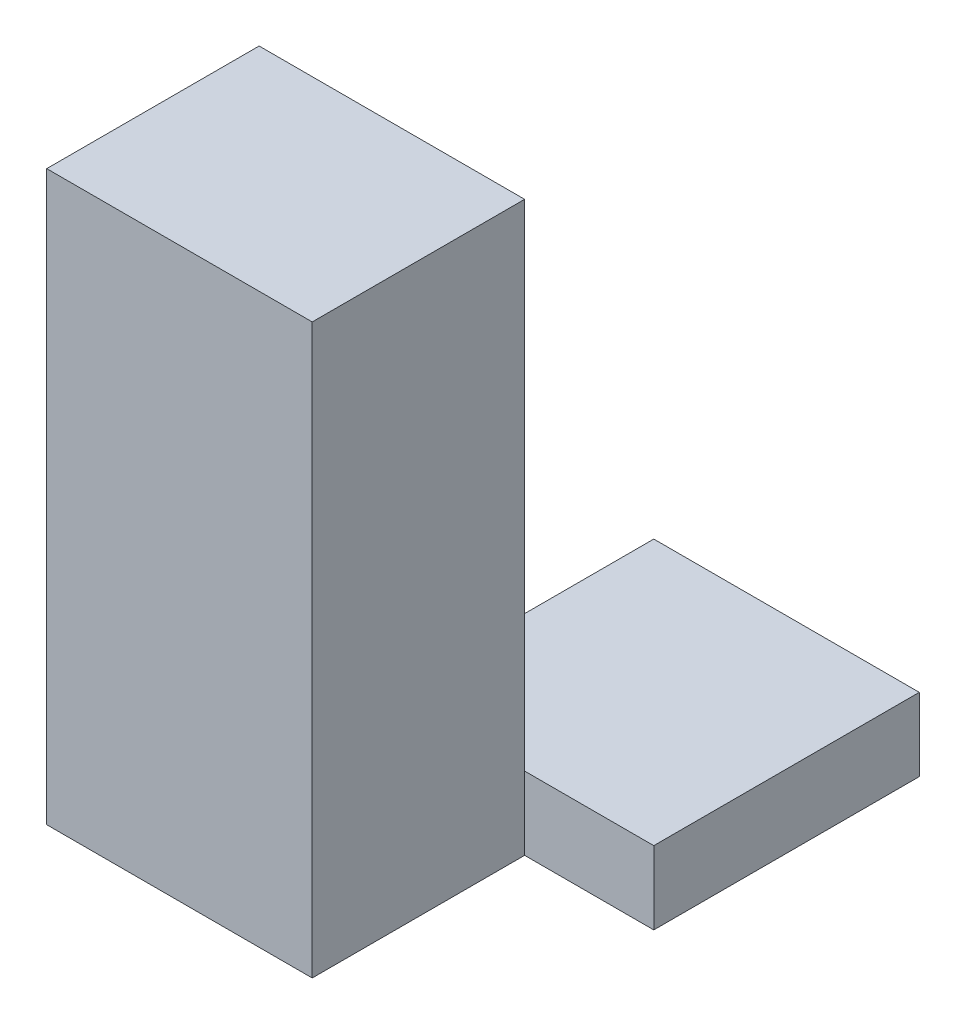
ISO-10303-21;
HEADER;
FILE_DESCRIPTION(('STEP AP214'),'2;1');
FILE_NAME('part.step','',(''),(''),'','','');
FILE_SCHEMA(('AUTOMOTIVE_DESIGN { 1 0 10303 214 1 1 1 1 }'));
ENDSEC;
DATA;
#1=APPLICATION_CONTEXT('core data for automotive mechanical design processes');
#2=APPLICATION_PROTOCOL_DEFINITION('international standard','automotive_design',2000,#1);
#3=PRODUCT_CONTEXT('',#1,'mechanical');
#4=PRODUCT('Part','Part','',(#3));
#5=PRODUCT_RELATED_PRODUCT_CATEGORY('part','',(#4));
#6=PRODUCT_DEFINITION_FORMATION('','',#4);
#7=PRODUCT_DEFINITION_CONTEXT('part definition',#1,'design');
#8=PRODUCT_DEFINITION('design','',#6,#7);
#9=PRODUCT_DEFINITION_SHAPE('','',#8);
#10=(LENGTH_UNIT() NAMED_UNIT(*) SI_UNIT(.MILLI.,.METRE.));
#11=(NAMED_UNIT(*) PLANE_ANGLE_UNIT() SI_UNIT($,.RADIAN.));
#12=(NAMED_UNIT(*) SI_UNIT($,.STERADIAN.) SOLID_ANGLE_UNIT());
#13=UNCERTAINTY_MEASURE_WITH_UNIT(LENGTH_MEASURE(1.E-05),#10,'distance_accuracy_value','');
#14=(GEOMETRIC_REPRESENTATION_CONTEXT(3) GLOBAL_UNCERTAINTY_ASSIGNED_CONTEXT((#13)) GLOBAL_UNIT_ASSIGNED_CONTEXT((#10,
#11,#12)) REPRESENTATION_CONTEXT('',''));
#15=CARTESIAN_POINT('',(0.,0.,0.));
#16=DIRECTION('',(0.,0.,1.));
#17=DIRECTION('',(1.,0.,0.));
#18=AXIS2_PLACEMENT_3D('',#15,#16,#17);
#19=CARTESIAN_POINT('',(0.,0.,0.));
#20=DIRECTION('',(0.,0.,-1.));
#21=DIRECTION('',(-1.,0.,0.));
#22=AXIS2_PLACEMENT_3D('',#19,#20,#21);
#23=PLANE('',#22);
#24=DIRECTION('',(-1.,0.,0.));
#25=VECTOR('',#24,1.);
#26=CARTESIAN_POINT('',(40.,-46.7266968325792,0.));
#27=LINE('',#26,#25);
#28=CARTESIAN_POINT('',(20.5429864253394,-46.7266968325792,0.));
#29=VERTEX_POINT('',#28);
#30=CARTESIAN_POINT('',(0.,-46.7266968325792,0.));
#31=VERTEX_POINT('',#30);
#32=EDGE_CURVE('E11',#29,#31,#27,.T.);
#33=ORIENTED_EDGE('',*,*,#32,.T.);
#34=DIRECTION('',(0.,-1.,0.));
#35=VECTOR('',#34,1.);
#36=CARTESIAN_POINT('',(0.,-57.7266968325792,0.));
#37=LINE('',#36,#35);
#38=CARTESIAN_POINT('',(0.,-57.7266968325792,0.));
#39=VERTEX_POINT('',#38);
#40=EDGE_CURVE('E61',#31,#39,#37,.T.);
#41=ORIENTED_EDGE('',*,*,#40,.T.);
#42=DIRECTION('',(1.,0.,0.));
#43=VECTOR('',#42,1.);
#44=CARTESIAN_POINT('',(-19.4570135746606,-57.7266968325792,0.));
#45=LINE('',#44,#43);
#46=CARTESIAN_POINT('',(-19.4570135746606,-57.7266968325792,0.));
#47=VERTEX_POINT('',#46);
#48=EDGE_CURVE('E170',#47,#39,#45,.T.);
#49=ORIENTED_EDGE('',*,*,#48,.F.);
#50=DIRECTION('',(0.,-1.,0.));
#51=VECTOR('',#50,1.);
#52=CARTESIAN_POINT('',(-19.4570135746606,-57.7266968325792,0.));
#53=LINE('',#52,#51);
#54=CARTESIAN_POINT('',(-19.4570135746606,27.8733031674208,0.));
#55=VERTEX_POINT('',#54);
#56=EDGE_CURVE('E91',#55,#47,#53,.T.);
#57=ORIENTED_EDGE('',*,*,#56,.F.);
#58=DIRECTION('',(-1.,0.,0.));
#59=VECTOR('',#58,1.);
#60=CARTESIAN_POINT('',(-19.4570135746606,27.8733031674208,0.));
#61=LINE('',#60,#59);
#62=CARTESIAN_POINT('',(20.5429864253394,27.8733031674208,0.));
#63=VERTEX_POINT('',#62);
#64=EDGE_CURVE('E177',#63,#55,#61,.T.);
#65=ORIENTED_EDGE('',*,*,#64,.F.);
#66=DIRECTION('',(0.,1.,0.));
#67=VECTOR('',#66,1.);
#68=CARTESIAN_POINT('',(20.5429864253394,-57.7266968325792,0.));
#69=LINE('',#68,#67);
#70=EDGE_CURVE('E160',#29,#63,#69,.T.);
#71=ORIENTED_EDGE('',*,*,#70,.F.);
#72=EDGE_LOOP('',(#33,#41,#49,#57,#65,#71));
#73=FACE_BOUND('',#72,.T.);
#74=ADVANCED_FACE('F44',(#73),#23,.T.);
#75=CARTESIAN_POINT('',(20.5429864253394,-57.7266968325792,32.));
#76=DIRECTION('',(-1.,0.,0.));
#77=DIRECTION('',(0.,0.,1.));
#78=AXIS2_PLACEMENT_3D('',#75,#76,#77);
#79=PLANE('',#78);
#80=CARTESIAN_POINT('',(20.5429864253394,-57.7266968325792,0.));
#81=VERTEX_POINT('',#80);
#82=EDGE_CURVE('E154',#81,#29,#69,.T.);
#83=ORIENTED_EDGE('',*,*,#82,.T.);
#84=ORIENTED_EDGE('',*,*,#70,.T.);
#85=DIRECTION('',(0.,0.,-1.));
#86=VECTOR('',#85,1.);
#87=CARTESIAN_POINT('',(20.5429864253394,27.8733031674208,32.));
#88=LINE('',#87,#86);
#89=CARTESIAN_POINT('',(20.5429864253394,27.8733031674208,32.));
#90=VERTEX_POINT('',#89);
#91=EDGE_CURVE('E47',#90,#63,#88,.T.);
#92=ORIENTED_EDGE('',*,*,#91,.F.);
#93=DIRECTION('',(0.,1.,0.));
#94=VECTOR('',#93,1.);
#95=CARTESIAN_POINT('',(20.5429864253394,-57.7266968325792,32.));
#96=LINE('',#95,#94);
#97=CARTESIAN_POINT('',(20.5429864253394,-57.7266968325792,32.));
#98=VERTEX_POINT('',#97);
#99=EDGE_CURVE('E168',#98,#90,#96,.T.);
#100=ORIENTED_EDGE('',*,*,#99,.F.);
#101=DIRECTION('',(0.,0.,-1.));
#102=VECTOR('',#101,1.);
#103=CARTESIAN_POINT('',(20.5429864253394,-57.7266968325792,32.));
#104=LINE('',#103,#102);
#105=EDGE_CURVE('E176',#98,#81,#104,.T.);
#106=ORIENTED_EDGE('',*,*,#105,.T.);
#107=EDGE_LOOP('',(#83,#84,#92,#100,#106));
#108=FACE_BOUND('',#107,.T.);
#109=ADVANCED_FACE('F50',(#108),#79,.F.);
#110=CARTESIAN_POINT('',(-19.4570135746606,27.8733031674208,32.));
#111=DIRECTION('',(0.,-1.,0.));
#112=DIRECTION('',(0.,0.,-1.));
#113=AXIS2_PLACEMENT_3D('',#110,#111,#112);
#114=PLANE('',#113);
#115=ORIENTED_EDGE('',*,*,#64,.T.);
#116=DIRECTION('',(0.,0.,-1.));
#117=VECTOR('',#116,1.);
#118=CARTESIAN_POINT('',(-19.4570135746606,27.8733031674208,32.));
#119=LINE('',#118,#117);
#120=CARTESIAN_POINT('',(-19.4570135746606,27.8733031674208,32.));
#121=VERTEX_POINT('',#120);
#122=EDGE_CURVE('E189',#121,#55,#119,.T.);
#123=ORIENTED_EDGE('',*,*,#122,.F.);
#124=DIRECTION('',(-1.,0.,0.));
#125=VECTOR('',#124,1.);
#126=CARTESIAN_POINT('',(-19.4570135746606,27.8733031674208,32.));
#127=LINE('',#126,#125);
#128=EDGE_CURVE('E98',#90,#121,#127,.T.);
#129=ORIENTED_EDGE('',*,*,#128,.F.);
#130=ORIENTED_EDGE('',*,*,#91,.T.);
#131=EDGE_LOOP('',(#115,#123,#129,#130));
#132=FACE_BOUND('',#131,.T.);
#133=ADVANCED_FACE('F193',(#132),#114,.F.);
#134=CARTESIAN_POINT('',(-19.4570135746606,-57.7266968325792,32.));
#135=DIRECTION('',(1.,0.,0.));
#136=DIRECTION('',(0.,1.,0.));
#137=AXIS2_PLACEMENT_3D('',#134,#135,#136);
#138=PLANE('',#137);
#139=ORIENTED_EDGE('',*,*,#56,.T.);
#140=DIRECTION('',(0.,0.,-1.));
#141=VECTOR('',#140,1.);
#142=CARTESIAN_POINT('',(-19.4570135746606,-57.7266968325792,32.));
#143=LINE('',#142,#141);
#144=CARTESIAN_POINT('',(-19.4570135746606,-57.7266968325792,32.));
#145=VERTEX_POINT('',#144);
#146=EDGE_CURVE('E187',#145,#47,#143,.T.);
#147=ORIENTED_EDGE('',*,*,#146,.F.);
#148=DIRECTION('',(0.,-1.,0.));
#149=VECTOR('',#148,1.);
#150=CARTESIAN_POINT('',(-19.4570135746606,-57.7266968325792,32.));
#151=LINE('',#150,#149);
#152=EDGE_CURVE('E175',#121,#145,#151,.T.);
#153=ORIENTED_EDGE('',*,*,#152,.F.);
#154=ORIENTED_EDGE('',*,*,#122,.T.);
#155=EDGE_LOOP('',(#139,#147,#153,#154));
#156=FACE_BOUND('',#155,.T.);
#157=ADVANCED_FACE('F201',(#156),#138,.F.);
#158=CARTESIAN_POINT('',(-19.4570135746606,-57.7266968325792,32.));
#159=DIRECTION('',(0.,1.,0.));
#160=DIRECTION('',(0.,0.,1.));
#161=AXIS2_PLACEMENT_3D('',#158,#159,#160);
#162=PLANE('',#161);
#163=ORIENTED_EDGE('',*,*,#48,.T.);
#164=DIRECTION('',(0.,0.,-1.));
#165=VECTOR('',#164,1.);
#166=CARTESIAN_POINT('',(0.,-57.7266968325792,0.));
#167=LINE('',#166,#165);
#168=CARTESIAN_POINT('',(0.,-57.7266968325792,-40.));
#169=VERTEX_POINT('',#168);
#170=EDGE_CURVE('E205',#39,#169,#167,.T.);
#171=ORIENTED_EDGE('',*,*,#170,.T.);
#172=DIRECTION('',(-1.,0.,0.));
#173=VECTOR('',#172,1.);
#174=CARTESIAN_POINT('',(40.,-57.7266968325792,-40.));
#175=LINE('',#174,#173);
#176=CARTESIAN_POINT('',(40.,-57.7266968325792,-40.));
#177=VERTEX_POINT('',#176);
#178=EDGE_CURVE('E136',#177,#169,#175,.T.);
#179=ORIENTED_EDGE('',*,*,#178,.F.);
#180=DIRECTION('',(0.,0.,-1.));
#181=VECTOR('',#180,1.);
#182=CARTESIAN_POINT('',(40.,-57.7266968325792,0.));
#183=LINE('',#182,#181);
#184=CARTESIAN_POINT('',(40.,-57.7266968325792,0.));
#185=VERTEX_POINT('',#184);
#186=EDGE_CURVE('E126',#185,#177,#183,.T.);
#187=ORIENTED_EDGE('',*,*,#186,.F.);
#188=DIRECTION('',(-1.,0.,0.));
#189=VECTOR('',#188,1.);
#190=CARTESIAN_POINT('',(40.,-57.7266968325792,0.));
#191=LINE('',#190,#189);
#192=EDGE_CURVE('E133',#185,#81,#191,.T.);
#193=ORIENTED_EDGE('',*,*,#192,.T.);
#194=ORIENTED_EDGE('',*,*,#105,.F.);
#195=DIRECTION('',(1.,0.,0.));
#196=VECTOR('',#195,1.);
#197=CARTESIAN_POINT('',(-19.4570135746606,-57.7266968325792,32.));
#198=LINE('',#197,#196);
#199=EDGE_CURVE('E75',#145,#98,#198,.T.);
#200=ORIENTED_EDGE('',*,*,#199,.F.);
#201=ORIENTED_EDGE('',*,*,#146,.T.);
#202=EDGE_LOOP('',(#163,#171,#179,#187,#193,#194,#200,#201));
#203=FACE_BOUND('',#202,.T.);
#204=ADVANCED_FACE('F131',(#203),#162,.F.);
#205=CARTESIAN_POINT('',(0.,0.,32.));
#206=DIRECTION('',(0.,0.,-1.));
#207=DIRECTION('',(-1.,0.,0.));
#208=AXIS2_PLACEMENT_3D('',#205,#206,#207);
#209=PLANE('',#208);
#210=ORIENTED_EDGE('',*,*,#99,.T.);
#211=ORIENTED_EDGE('',*,*,#128,.T.);
#212=ORIENTED_EDGE('',*,*,#152,.T.);
#213=ORIENTED_EDGE('',*,*,#199,.T.);
#214=EDGE_LOOP('',(#210,#211,#212,#213));
#215=FACE_BOUND('',#214,.T.);
#216=ADVANCED_FACE('F204',(#215),#209,.F.);
#217=CARTESIAN_POINT('',(40.,-57.7266968325792,0.));
#218=DIRECTION('',(0.,0.,-1.));
#219=DIRECTION('',(-1.,0.,0.));
#220=AXIS2_PLACEMENT_3D('',#217,#218,#219);
#221=PLANE('',#220);
#222=ORIENTED_EDGE('',*,*,#82,.F.);
#223=ORIENTED_EDGE('',*,*,#192,.F.);
#224=DIRECTION('',(0.,-1.,0.));
#225=VECTOR('',#224,1.);
#226=CARTESIAN_POINT('',(40.,-57.7266968325792,0.));
#227=LINE('',#226,#225);
#228=CARTESIAN_POINT('',(40.,-46.7266968325792,0.));
#229=VERTEX_POINT('',#228);
#230=EDGE_CURVE('E141',#229,#185,#227,.T.);
#231=ORIENTED_EDGE('',*,*,#230,.F.);
#232=EDGE_CURVE('E57',#229,#29,#27,.T.);
#233=ORIENTED_EDGE('',*,*,#232,.T.);
#234=EDGE_LOOP('',(#222,#223,#231,#233));
#235=FACE_BOUND('',#234,.T.);
#236=ADVANCED_FACE('F151',(#235),#221,.F.);
#237=CARTESIAN_POINT('',(40.,-57.7266968325792,-40.));
#238=DIRECTION('',(0.,0.,1.));
#239=DIRECTION('',(1.,0.,0.));
#240=AXIS2_PLACEMENT_3D('',#237,#238,#239);
#241=PLANE('',#240);
#242=DIRECTION('',(0.,1.,0.));
#243=VECTOR('',#242,1.);
#244=CARTESIAN_POINT('',(0.,-57.7266968325792,-40.));
#245=LINE('',#244,#243);
#246=CARTESIAN_POINT('',(0.,-46.7266968325792,-40.));
#247=VERTEX_POINT('',#246);
#248=EDGE_CURVE('E301',#169,#247,#245,.T.);
#249=ORIENTED_EDGE('',*,*,#248,.T.);
#250=DIRECTION('',(-1.,0.,0.));
#251=VECTOR('',#250,1.);
#252=CARTESIAN_POINT('',(40.,-46.7266968325792,-40.));
#253=LINE('',#252,#251);
#254=CARTESIAN_POINT('',(40.,-46.7266968325792,-40.));
#255=VERTEX_POINT('',#254);
#256=EDGE_CURVE('E165',#255,#247,#253,.T.);
#257=ORIENTED_EDGE('',*,*,#256,.F.);
#258=DIRECTION('',(0.,1.,0.));
#259=VECTOR('',#258,1.);
#260=CARTESIAN_POINT('',(40.,-57.7266968325792,-40.));
#261=LINE('',#260,#259);
#262=EDGE_CURVE('E139',#177,#255,#261,.T.);
#263=ORIENTED_EDGE('',*,*,#262,.F.);
#264=ORIENTED_EDGE('',*,*,#178,.T.);
#265=EDGE_LOOP('',(#249,#257,#263,#264));
#266=FACE_BOUND('',#265,.T.);
#267=ADVANCED_FACE('F212',(#266),#241,.F.);
#268=CARTESIAN_POINT('',(40.,-46.7266968325792,0.));
#269=DIRECTION('',(0.,-1.,0.));
#270=DIRECTION('',(0.,0.,-1.));
#271=AXIS2_PLACEMENT_3D('',#268,#269,#270);
#272=PLANE('',#271);
#273=DIRECTION('',(0.,0.,1.));
#274=VECTOR('',#273,1.);
#275=CARTESIAN_POINT('',(0.,-46.7266968325792,0.));
#276=LINE('',#275,#274);
#277=EDGE_CURVE('E153',#247,#31,#276,.T.);
#278=ORIENTED_EDGE('',*,*,#277,.T.);
#279=ORIENTED_EDGE('',*,*,#32,.F.);
#280=ORIENTED_EDGE('',*,*,#232,.F.);
#281=DIRECTION('',(0.,0.,1.));
#282=VECTOR('',#281,1.);
#283=CARTESIAN_POINT('',(40.,-46.7266968325792,0.));
#284=LINE('',#283,#282);
#285=EDGE_CURVE('E147',#255,#229,#284,.T.);
#286=ORIENTED_EDGE('',*,*,#285,.F.);
#287=ORIENTED_EDGE('',*,*,#256,.T.);
#288=EDGE_LOOP('',(#278,#279,#280,#286,#287));
#289=FACE_BOUND('',#288,.T.);
#290=ADVANCED_FACE('F259',(#289),#272,.F.);
#291=CARTESIAN_POINT('',(40.,0.,0.));
#292=DIRECTION('',(-1.,0.,0.));
#293=DIRECTION('',(0.,0.,1.));
#294=AXIS2_PLACEMENT_3D('',#291,#292,#293);
#295=PLANE('',#294);
#296=ORIENTED_EDGE('',*,*,#230,.T.);
#297=ORIENTED_EDGE('',*,*,#186,.T.);
#298=ORIENTED_EDGE('',*,*,#262,.T.);
#299=ORIENTED_EDGE('',*,*,#285,.T.);
#300=EDGE_LOOP('',(#296,#297,#298,#299));
#301=FACE_BOUND('',#300,.T.);
#302=ADVANCED_FACE('F143',(#301),#295,.F.);
#303=CARTESIAN_POINT('',(0.,0.,0.));
#304=DIRECTION('',(-1.,0.,0.));
#305=DIRECTION('',(0.,0.,1.));
#306=AXIS2_PLACEMENT_3D('',#303,#304,#305);
#307=PLANE('',#306);
#308=ORIENTED_EDGE('',*,*,#40,.F.);
#309=ORIENTED_EDGE('',*,*,#277,.F.);
#310=ORIENTED_EDGE('',*,*,#248,.F.);
#311=ORIENTED_EDGE('',*,*,#170,.F.);
#312=EDGE_LOOP('',(#308,#309,#310,#311));
#313=FACE_BOUND('',#312,.T.);
#314=ADVANCED_FACE('F280',(#313),#307,.T.);
#315=CLOSED_SHELL('',(#74,#109,#133,#157,#204,#216,#236,#267,#290,#302,#314));
#316=MANIFOLD_SOLID_BREP('B2',#315);
#317=ADVANCED_BREP_SHAPE_REPRESENTATION('',(#18,#316),#14);
#318=SHAPE_DEFINITION_REPRESENTATION(#9,#317);
ENDSEC;
END-ISO-10303-21;
